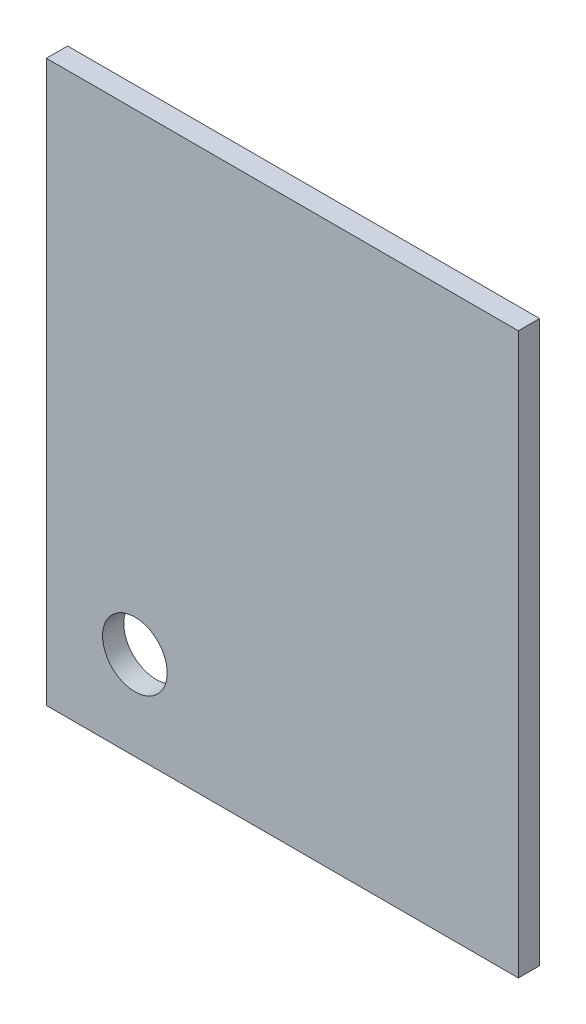
ISO-10303-21;
HEADER;
FILE_DESCRIPTION(('STEP AP214'),'2;1');
FILE_NAME('part.step','',(''),(''),'','','');
FILE_SCHEMA(('AUTOMOTIVE_DESIGN { 1 0 10303 214 1 1 1 1 }'));
ENDSEC;
DATA;
#1=APPLICATION_CONTEXT('core data for automotive mechanical design processes');
#2=APPLICATION_PROTOCOL_DEFINITION('international standard','automotive_design',2000,#1);
#3=PRODUCT_CONTEXT('',#1,'mechanical');
#4=PRODUCT('Part','Part','',(#3));
#5=PRODUCT_RELATED_PRODUCT_CATEGORY('part','',(#4));
#6=PRODUCT_DEFINITION_FORMATION('','',#4);
#7=PRODUCT_DEFINITION_CONTEXT('part definition',#1,'design');
#8=PRODUCT_DEFINITION('design','',#6,#7);
#9=PRODUCT_DEFINITION_SHAPE('','',#8);
#10=(LENGTH_UNIT() NAMED_UNIT(*) SI_UNIT(.MILLI.,.METRE.));
#11=(NAMED_UNIT(*) PLANE_ANGLE_UNIT() SI_UNIT($,.RADIAN.));
#12=(NAMED_UNIT(*) SI_UNIT($,.STERADIAN.) SOLID_ANGLE_UNIT());
#13=UNCERTAINTY_MEASURE_WITH_UNIT(LENGTH_MEASURE(1.E-05),#10,'distance_accuracy_value','');
#14=(GEOMETRIC_REPRESENTATION_CONTEXT(3) GLOBAL_UNCERTAINTY_ASSIGNED_CONTEXT((#13)) GLOBAL_UNIT_ASSIGNED_CONTEXT((#10,
#11,#12)) REPRESENTATION_CONTEXT('',''));
#15=CARTESIAN_POINT('',(0.,0.,0.));
#16=DIRECTION('',(0.,0.,1.));
#17=DIRECTION('',(1.,0.,0.));
#18=AXIS2_PLACEMENT_3D('',#15,#16,#17);
#19=CARTESIAN_POINT('',(0.,0.,-2.286));
#20=DIRECTION('',(-1.,0.,0.));
#21=DIRECTION('',(0.,0.,1.));
#22=AXIS2_PLACEMENT_3D('',#19,#20,#21);
#23=PLANE('',#22);
#24=DIRECTION('',(0.,-1.,0.));
#25=VECTOR('',#24,1.);
#26=CARTESIAN_POINT('',(0.,0.,0.));
#27=LINE('',#26,#25);
#28=CARTESIAN_POINT('',(0.,60.325,0.));
#29=VERTEX_POINT('',#28);
#30=CARTESIAN_POINT('',(0.,0.,0.));
#31=VERTEX_POINT('',#30);
#32=EDGE_CURVE('E96',#29,#31,#27,.T.);
#33=ORIENTED_EDGE('',*,*,#32,.F.);
#34=DIRECTION('',(0.,0.,1.));
#35=VECTOR('',#34,1.);
#36=CARTESIAN_POINT('',(0.,60.325,-2.286));
#37=LINE('',#36,#35);
#38=CARTESIAN_POINT('',(0.,60.325,-2.286));
#39=VERTEX_POINT('',#38);
#40=EDGE_CURVE('E11',#39,#29,#37,.T.);
#41=ORIENTED_EDGE('',*,*,#40,.F.);
#42=DIRECTION('',(0.,-1.,0.));
#43=VECTOR('',#42,1.);
#44=CARTESIAN_POINT('',(0.,0.,-2.286));
#45=LINE('',#44,#43);
#46=CARTESIAN_POINT('',(0.,0.,-2.286));
#47=VERTEX_POINT('',#46);
#48=EDGE_CURVE('E89',#39,#47,#45,.T.);
#49=ORIENTED_EDGE('',*,*,#48,.T.);
#50=DIRECTION('',(0.,0.,1.));
#51=VECTOR('',#50,1.);
#52=CARTESIAN_POINT('',(0.,0.,-2.286));
#53=LINE('',#52,#51);
#54=EDGE_CURVE('E34',#47,#31,#53,.T.);
#55=ORIENTED_EDGE('',*,*,#54,.T.);
#56=EDGE_LOOP('',(#33,#41,#49,#55));
#57=FACE_BOUND('',#56,.T.);
#58=ADVANCED_FACE('F31',(#57),#23,.T.);
#59=CARTESIAN_POINT('',(0.,60.325,-2.286));
#60=DIRECTION('',(0.,1.,0.));
#61=DIRECTION('',(0.,0.,1.));
#62=AXIS2_PLACEMENT_3D('',#59,#60,#61);
#63=PLANE('',#62);
#64=DIRECTION('',(-1.,0.,0.));
#65=VECTOR('',#64,1.);
#66=CARTESIAN_POINT('',(0.,60.325,0.));
#67=LINE('',#66,#65);
#68=CARTESIAN_POINT('',(50.8,60.325,0.));
#69=VERTEX_POINT('',#68);
#70=EDGE_CURVE('E91',#69,#29,#67,.T.);
#71=ORIENTED_EDGE('',*,*,#70,.F.);
#72=DIRECTION('',(0.,0.,1.));
#73=VECTOR('',#72,1.);
#74=CARTESIAN_POINT('',(50.8,60.325,-2.286));
#75=LINE('',#74,#73);
#76=CARTESIAN_POINT('',(50.8,60.325,-2.286));
#77=VERTEX_POINT('',#76);
#78=EDGE_CURVE('E40',#77,#69,#75,.T.);
#79=ORIENTED_EDGE('',*,*,#78,.F.);
#80=DIRECTION('',(-1.,0.,0.));
#81=VECTOR('',#80,1.);
#82=CARTESIAN_POINT('',(0.,60.325,-2.286));
#83=LINE('',#82,#81);
#84=EDGE_CURVE('E86',#77,#39,#83,.T.);
#85=ORIENTED_EDGE('',*,*,#84,.T.);
#86=ORIENTED_EDGE('',*,*,#40,.T.);
#87=EDGE_LOOP('',(#71,#79,#85,#86));
#88=FACE_BOUND('',#87,.T.);
#89=ADVANCED_FACE('F107',(#88),#63,.T.);
#90=CARTESIAN_POINT('',(50.8,0.,-2.286));
#91=DIRECTION('',(1.,0.,0.));
#92=DIRECTION('',(0.,0.,-1.));
#93=AXIS2_PLACEMENT_3D('',#90,#91,#92);
#94=PLANE('',#93);
#95=DIRECTION('',(0.,1.,0.));
#96=VECTOR('',#95,1.);
#97=CARTESIAN_POINT('',(50.8,0.,0.));
#98=LINE('',#97,#96);
#99=CARTESIAN_POINT('',(50.8,0.,0.));
#100=VERTEX_POINT('',#99);
#101=EDGE_CURVE('E81',#100,#69,#98,.T.);
#102=ORIENTED_EDGE('',*,*,#101,.F.);
#103=DIRECTION('',(0.,0.,1.));
#104=VECTOR('',#103,1.);
#105=CARTESIAN_POINT('',(50.8,0.,-2.286));
#106=LINE('',#105,#104);
#107=CARTESIAN_POINT('',(50.8,0.,-2.286));
#108=VERTEX_POINT('',#107);
#109=EDGE_CURVE('E76',#108,#100,#106,.T.);
#110=ORIENTED_EDGE('',*,*,#109,.F.);
#111=DIRECTION('',(0.,1.,0.));
#112=VECTOR('',#111,1.);
#113=CARTESIAN_POINT('',(50.8,0.,-2.286));
#114=LINE('',#113,#112);
#115=EDGE_CURVE('E79',#108,#77,#114,.T.);
#116=ORIENTED_EDGE('',*,*,#115,.T.);
#117=ORIENTED_EDGE('',*,*,#78,.T.);
#118=EDGE_LOOP('',(#102,#110,#116,#117));
#119=FACE_BOUND('',#118,.T.);
#120=ADVANCED_FACE('F78',(#119),#94,.T.);
#121=CARTESIAN_POINT('',(0.,0.,-2.286));
#122=DIRECTION('',(0.,-1.,0.));
#123=DIRECTION('',(0.,0.,-1.));
#124=AXIS2_PLACEMENT_3D('',#121,#122,#123);
#125=PLANE('',#124);
#126=DIRECTION('',(1.,0.,0.));
#127=VECTOR('',#126,1.);
#128=CARTESIAN_POINT('',(0.,0.,0.));
#129=LINE('',#128,#127);
#130=EDGE_CURVE('E99',#31,#100,#129,.T.);
#131=ORIENTED_EDGE('',*,*,#130,.F.);
#132=ORIENTED_EDGE('',*,*,#54,.F.);
#133=DIRECTION('',(1.,0.,0.));
#134=VECTOR('',#133,1.);
#135=CARTESIAN_POINT('',(0.,0.,-2.286));
#136=LINE('',#135,#134);
#137=EDGE_CURVE('E85',#47,#108,#136,.T.);
#138=ORIENTED_EDGE('',*,*,#137,.T.);
#139=ORIENTED_EDGE('',*,*,#109,.T.);
#140=EDGE_LOOP('',(#131,#132,#138,#139));
#141=FACE_BOUND('',#140,.T.);
#142=ADVANCED_FACE('F88',(#141),#125,.T.);
#143=CARTESIAN_POINT('',(0.,60.325,-2.286));
#144=DIRECTION('',(0.,0.,-1.));
#145=DIRECTION('',(-1.,0.,0.));
#146=AXIS2_PLACEMENT_3D('',#143,#144,#145);
#147=PLANE('',#146);
#148=CARTESIAN_POINT('',(9.525,9.525,-2.286));
#149=DIRECTION('',(0.,0.,1.));
#150=DIRECTION('',(1.,0.,0.));
#151=AXIS2_PLACEMENT_3D('',#148,#149,#150);
#152=CIRCLE('',#151,3.48005261822538);
#153=CARTESIAN_POINT('',(13.0050526182254,9.525,-2.286));
#154=VERTEX_POINT('',#153);
#155=EDGE_CURVE('E100',#154,#154,#152,.T.);
#156=ORIENTED_EDGE('',*,*,#155,.T.);
#157=EDGE_LOOP('',(#156));
#158=FACE_BOUND('',#157,.T.);
#159=ORIENTED_EDGE('',*,*,#48,.F.);
#160=ORIENTED_EDGE('',*,*,#84,.F.);
#161=ORIENTED_EDGE('',*,*,#115,.F.);
#162=ORIENTED_EDGE('',*,*,#137,.F.);
#163=EDGE_LOOP('',(#159,#160,#161,#162));
#164=FACE_BOUND('',#163,.T.);
#165=ADVANCED_FACE('F84',(#158,#164),#147,.T.);
#166=CARTESIAN_POINT('',(0.,60.325,0.));
#167=DIRECTION('',(0.,0.,-1.));
#168=DIRECTION('',(-1.,0.,0.));
#169=AXIS2_PLACEMENT_3D('',#166,#167,#168);
#170=PLANE('',#169);
#171=CARTESIAN_POINT('',(9.525,9.525,0.));
#172=DIRECTION('',(0.,0.,1.));
#173=DIRECTION('',(1.,0.,0.));
#174=AXIS2_PLACEMENT_3D('',#171,#172,#173);
#175=CIRCLE('',#174,3.48005261822538);
#176=CARTESIAN_POINT('',(13.0050526182254,9.525,0.));
#177=VERTEX_POINT('',#176);
#178=EDGE_CURVE('E137',#177,#177,#175,.T.);
#179=ORIENTED_EDGE('',*,*,#178,.F.);
#180=EDGE_LOOP('',(#179));
#181=FACE_BOUND('',#180,.T.);
#182=ORIENTED_EDGE('',*,*,#32,.T.);
#183=ORIENTED_EDGE('',*,*,#130,.T.);
#184=ORIENTED_EDGE('',*,*,#101,.T.);
#185=ORIENTED_EDGE('',*,*,#70,.T.);
#186=EDGE_LOOP('',(#182,#183,#184,#185));
#187=FACE_BOUND('',#186,.T.);
#188=ADVANCED_FACE('F106',(#181,#187),#170,.F.);
#189=CARTESIAN_POINT('',(9.525,9.525,-2.286));
#190=DIRECTION('',(0.,0.,1.));
#191=DIRECTION('',(1.,0.,0.));
#192=AXIS2_PLACEMENT_3D('',#189,#190,#191);
#193=CYLINDRICAL_SURFACE('',#192,3.48005261822538);
#194=ORIENTED_EDGE('',*,*,#155,.F.);
#195=EDGE_LOOP('',(#194));
#196=FACE_BOUND('',#195,.T.);
#197=ORIENTED_EDGE('',*,*,#178,.T.);
#198=EDGE_LOOP('',(#197));
#199=FACE_BOUND('',#198,.T.);
#200=ADVANCED_FACE('F125',(#196,#199),#193,.F.);
#201=CLOSED_SHELL('',(#58,#89,#120,#142,#165,#188,#200));
#202=MANIFOLD_SOLID_BREP('B2',#201);
#203=ADVANCED_BREP_SHAPE_REPRESENTATION('',(#18,#202),#14);
#204=SHAPE_DEFINITION_REPRESENTATION(#9,#203);
ENDSEC;
END-ISO-10303-21;
